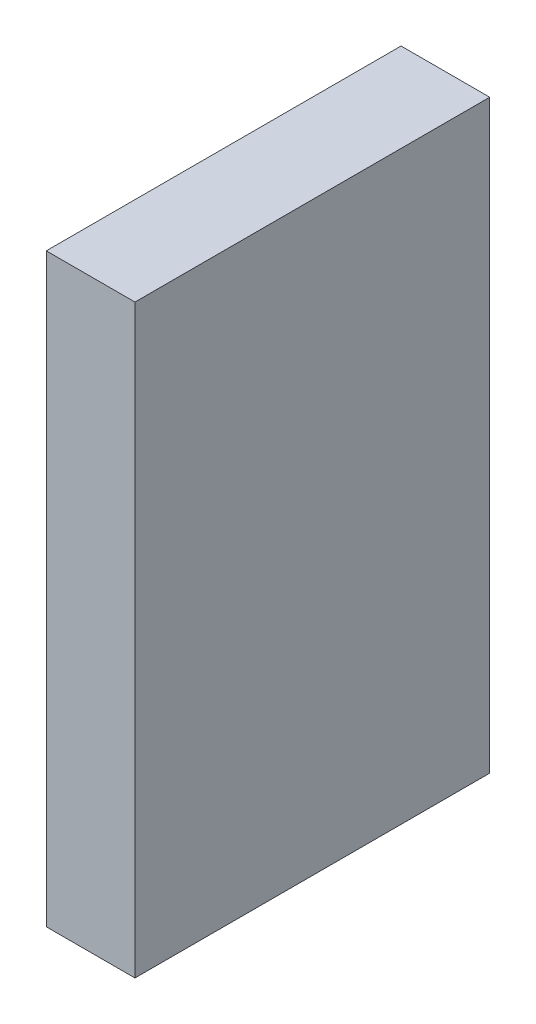
ISO-10303-21;
HEADER;
FILE_DESCRIPTION(('STEP AP214'),'2;1');
FILE_NAME('part.step','',(''),(''),'','','');
FILE_SCHEMA(('AUTOMOTIVE_DESIGN { 1 0 10303 214 1 1 1 1 }'));
ENDSEC;
DATA;
#1=APPLICATION_CONTEXT('core data for automotive mechanical design processes');
#2=APPLICATION_PROTOCOL_DEFINITION('international standard','automotive_design',2000,#1);
#3=PRODUCT_CONTEXT('',#1,'mechanical');
#4=PRODUCT('Part','Part','',(#3));
#5=PRODUCT_RELATED_PRODUCT_CATEGORY('part','',(#4));
#6=PRODUCT_DEFINITION_FORMATION('','',#4);
#7=PRODUCT_DEFINITION_CONTEXT('part definition',#1,'design');
#8=PRODUCT_DEFINITION('design','',#6,#7);
#9=PRODUCT_DEFINITION_SHAPE('','',#8);
#10=(LENGTH_UNIT() NAMED_UNIT(*) SI_UNIT(.MILLI.,.METRE.));
#11=(NAMED_UNIT(*) PLANE_ANGLE_UNIT() SI_UNIT($,.RADIAN.));
#12=(NAMED_UNIT(*) SI_UNIT($,.STERADIAN.) SOLID_ANGLE_UNIT());
#13=UNCERTAINTY_MEASURE_WITH_UNIT(LENGTH_MEASURE(1.E-05),#10,'distance_accuracy_value','');
#14=(GEOMETRIC_REPRESENTATION_CONTEXT(3) GLOBAL_UNCERTAINTY_ASSIGNED_CONTEXT((#13)) GLOBAL_UNIT_ASSIGNED_CONTEXT((#10,
#11,#12)) REPRESENTATION_CONTEXT('',''));
#15=CARTESIAN_POINT('',(0.,0.,0.));
#16=DIRECTION('',(0.,0.,1.));
#17=DIRECTION('',(1.,0.,0.));
#18=AXIS2_PLACEMENT_3D('',#15,#16,#17);
#19=CARTESIAN_POINT('',(-3.05,1.55,1.));
#20=DIRECTION('',(-1.,0.,0.));
#21=DIRECTION('',(0.,0.,1.));
#22=AXIS2_PLACEMENT_3D('',#19,#20,#21);
#23=PLANE('',#22);
#24=DIRECTION('',(0.,1.,0.));
#25=VECTOR('',#24,1.);
#26=CARTESIAN_POINT('',(-3.05,3.2,0.));
#27=LINE('',#26,#25);
#28=CARTESIAN_POINT('',(-3.05,3.2,0.));
#29=VERTEX_POINT('',#28);
#30=CARTESIAN_POINT('',(-3.05,-0.100000000000001,0.));
#31=VERTEX_POINT('',#30);
#32=EDGE_CURVE('E58',#29,#31,#27,.F.);
#33=ORIENTED_EDGE('',*,*,#32,.F.);
#34=DIRECTION('',(0.,0.,1.));
#35=VECTOR('',#34,1.);
#36=CARTESIAN_POINT('',(-3.05,3.2,2.));
#37=LINE('',#36,#35);
#38=CARTESIAN_POINT('',(-3.05,3.2,2.));
#39=VERTEX_POINT('',#38);
#40=EDGE_CURVE('E53',#39,#29,#37,.F.);
#41=ORIENTED_EDGE('',*,*,#40,.F.);
#42=DIRECTION('',(0.,1.,0.));
#43=VECTOR('',#42,1.);
#44=CARTESIAN_POINT('',(-3.05,-0.100000000000001,2.));
#45=LINE('',#44,#43);
#46=CARTESIAN_POINT('',(-3.05,-0.100000000000001,2.));
#47=VERTEX_POINT('',#46);
#48=EDGE_CURVE('E68',#47,#39,#45,.T.);
#49=ORIENTED_EDGE('',*,*,#48,.F.);
#50=DIRECTION('',(0.,0.,-1.));
#51=VECTOR('',#50,1.);
#52=CARTESIAN_POINT('',(-3.05,-0.100000000000001,0.));
#53=LINE('',#52,#51);
#54=EDGE_CURVE('E20',#31,#47,#53,.F.);
#55=ORIENTED_EDGE('',*,*,#54,.F.);
#56=EDGE_LOOP('',(#33,#41,#49,#55));
#57=FACE_BOUND('',#56,.T.);
#58=ADVANCED_FACE('F17',(#57),#23,.F.);
#59=CARTESIAN_POINT('',(-3.05,-0.100000000000001,0.));
#60=DIRECTION('',(0.,-1.,0.));
#61=DIRECTION('',(0.,0.,-1.));
#62=AXIS2_PLACEMENT_3D('',#59,#60,#61);
#63=PLANE('',#62);
#64=DIRECTION('',(0.,0.,-1.));
#65=VECTOR('',#64,1.);
#66=CARTESIAN_POINT('',(-3.55,-0.100000000000001,1.));
#67=LINE('',#66,#65);
#68=CARTESIAN_POINT('',(-3.55,-0.100000000000001,2.));
#69=VERTEX_POINT('',#68);
#70=CARTESIAN_POINT('',(-3.55,-0.100000000000001,0.));
#71=VERTEX_POINT('',#70);
#72=EDGE_CURVE('E74',#69,#71,#67,.T.);
#73=ORIENTED_EDGE('',*,*,#72,.T.);
#74=DIRECTION('',(-1.,0.,0.));
#75=VECTOR('',#74,1.);
#76=CARTESIAN_POINT('',(-3.05,-0.100000000000001,0.));
#77=LINE('',#76,#75);
#78=EDGE_CURVE('E63',#31,#71,#77,.T.);
#79=ORIENTED_EDGE('',*,*,#78,.F.);
#80=ORIENTED_EDGE('',*,*,#54,.T.);
#81=DIRECTION('',(1.,0.,0.));
#82=VECTOR('',#81,1.);
#83=CARTESIAN_POINT('',(-3.05,-0.100000000000001,2.));
#84=LINE('',#83,#82);
#85=EDGE_CURVE('E81',#69,#47,#84,.T.);
#86=ORIENTED_EDGE('',*,*,#85,.F.);
#87=EDGE_LOOP('',(#73,#79,#80,#86));
#88=FACE_BOUND('',#87,.T.);
#89=ADVANCED_FACE('F73',(#88),#63,.T.);
#90=CARTESIAN_POINT('',(-3.05,3.2,0.));
#91=DIRECTION('',(0.,0.,-1.));
#92=DIRECTION('',(-1.,0.,0.));
#93=AXIS2_PLACEMENT_3D('',#90,#91,#92);
#94=PLANE('',#93);
#95=DIRECTION('',(0.,1.,0.));
#96=VECTOR('',#95,1.);
#97=CARTESIAN_POINT('',(-3.55,1.55,0.));
#98=LINE('',#97,#96);
#99=CARTESIAN_POINT('',(-3.55,3.2,0.));
#100=VERTEX_POINT('',#99);
#101=EDGE_CURVE('E84',#71,#100,#98,.T.);
#102=ORIENTED_EDGE('',*,*,#101,.T.);
#103=DIRECTION('',(1.,0.,0.));
#104=VECTOR('',#103,1.);
#105=CARTESIAN_POINT('',(-3.05,3.2,0.));
#106=LINE('',#105,#104);
#107=EDGE_CURVE('E65',#29,#100,#106,.F.);
#108=ORIENTED_EDGE('',*,*,#107,.F.);
#109=ORIENTED_EDGE('',*,*,#32,.T.);
#110=ORIENTED_EDGE('',*,*,#78,.T.);
#111=EDGE_LOOP('',(#102,#108,#109,#110));
#112=FACE_BOUND('',#111,.T.);
#113=ADVANCED_FACE('F61',(#112),#94,.T.);
#114=CARTESIAN_POINT('',(-3.05,3.2,2.));
#115=DIRECTION('',(0.,1.,0.));
#116=DIRECTION('',(0.,0.,1.));
#117=AXIS2_PLACEMENT_3D('',#114,#115,#116);
#118=PLANE('',#117);
#119=DIRECTION('',(0.,0.,-1.));
#120=VECTOR('',#119,1.);
#121=CARTESIAN_POINT('',(-3.55,3.2,1.));
#122=LINE('',#121,#120);
#123=CARTESIAN_POINT('',(-3.55,3.2,2.));
#124=VERTEX_POINT('',#123);
#125=EDGE_CURVE('E26',#100,#124,#122,.F.);
#126=ORIENTED_EDGE('',*,*,#125,.T.);
#127=DIRECTION('',(1.,0.,0.));
#128=VECTOR('',#127,1.);
#129=CARTESIAN_POINT('',(-3.05,3.2,2.));
#130=LINE('',#129,#128);
#131=EDGE_CURVE('E34',#39,#124,#130,.F.);
#132=ORIENTED_EDGE('',*,*,#131,.F.);
#133=ORIENTED_EDGE('',*,*,#40,.T.);
#134=ORIENTED_EDGE('',*,*,#107,.T.);
#135=EDGE_LOOP('',(#126,#132,#133,#134));
#136=FACE_BOUND('',#135,.T.);
#137=ADVANCED_FACE('F88',(#136),#118,.T.);
#138=CARTESIAN_POINT('',(-3.05,-0.100000000000001,2.));
#139=DIRECTION('',(0.,0.,1.));
#140=DIRECTION('',(1.,0.,0.));
#141=AXIS2_PLACEMENT_3D('',#138,#139,#140);
#142=PLANE('',#141);
#143=DIRECTION('',(0.,1.,0.));
#144=VECTOR('',#143,1.);
#145=CARTESIAN_POINT('',(-3.55,1.55,2.));
#146=LINE('',#145,#144);
#147=EDGE_CURVE('E11',#124,#69,#146,.F.);
#148=ORIENTED_EDGE('',*,*,#147,.T.);
#149=ORIENTED_EDGE('',*,*,#85,.T.);
#150=ORIENTED_EDGE('',*,*,#48,.T.);
#151=ORIENTED_EDGE('',*,*,#131,.T.);
#152=EDGE_LOOP('',(#148,#149,#150,#151));
#153=FACE_BOUND('',#152,.T.);
#154=ADVANCED_FACE('F91',(#153),#142,.T.);
#155=CARTESIAN_POINT('',(-3.55,1.55,1.));
#156=DIRECTION('',(1.,0.,0.));
#157=DIRECTION('',(0.,0.,-1.));
#158=AXIS2_PLACEMENT_3D('',#155,#156,#157);
#159=PLANE('',#158);
#160=ORIENTED_EDGE('',*,*,#125,.F.);
#161=ORIENTED_EDGE('',*,*,#101,.F.);
#162=ORIENTED_EDGE('',*,*,#72,.F.);
#163=ORIENTED_EDGE('',*,*,#147,.F.);
#164=EDGE_LOOP('',(#160,#161,#162,#163));
#165=FACE_BOUND('',#164,.T.);
#166=ADVANCED_FACE('F90',(#165),#159,.F.);
#167=CLOSED_SHELL('',(#58,#89,#113,#137,#154,#166));
#168=MANIFOLD_SOLID_BREP('B1',#167);
#169=ADVANCED_BREP_SHAPE_REPRESENTATION('',(#18,#168),#14);
#170=SHAPE_DEFINITION_REPRESENTATION(#9,#169);
ENDSEC;
END-ISO-10303-21;
